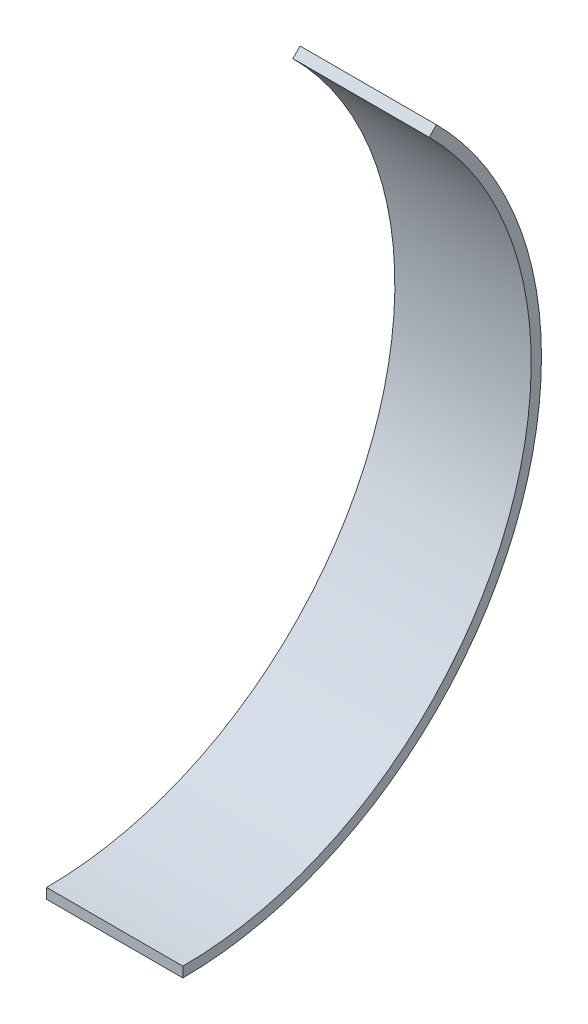
ISO-10303-21;
HEADER;
FILE_DESCRIPTION(('STEP AP214'),'2;1');
FILE_NAME('part.step','',(''),(''),'','','');
FILE_SCHEMA(('AUTOMOTIVE_DESIGN { 1 0 10303 214 1 1 1 1 }'));
ENDSEC;
DATA;
#1=APPLICATION_CONTEXT('core data for automotive mechanical design processes');
#2=APPLICATION_PROTOCOL_DEFINITION('international standard','automotive_design',2000,#1);
#3=PRODUCT_CONTEXT('',#1,'mechanical');
#4=PRODUCT('Part','Part','',(#3));
#5=PRODUCT_RELATED_PRODUCT_CATEGORY('part','',(#4));
#6=PRODUCT_DEFINITION_FORMATION('','',#4);
#7=PRODUCT_DEFINITION_CONTEXT('part definition',#1,'design');
#8=PRODUCT_DEFINITION('design','',#6,#7);
#9=PRODUCT_DEFINITION_SHAPE('','',#8);
#10=(LENGTH_UNIT() NAMED_UNIT(*) SI_UNIT(.MILLI.,.METRE.));
#11=(NAMED_UNIT(*) PLANE_ANGLE_UNIT() SI_UNIT($,.RADIAN.));
#12=(NAMED_UNIT(*) SI_UNIT($,.STERADIAN.) SOLID_ANGLE_UNIT());
#13=UNCERTAINTY_MEASURE_WITH_UNIT(LENGTH_MEASURE(1.E-05),#10,'distance_accuracy_value','');
#14=(GEOMETRIC_REPRESENTATION_CONTEXT(3) GLOBAL_UNCERTAINTY_ASSIGNED_CONTEXT((#13)) GLOBAL_UNIT_ASSIGNED_CONTEXT((#10,
#11,#12)) REPRESENTATION_CONTEXT('',''));
#15=CARTESIAN_POINT('',(0.,0.,0.));
#16=DIRECTION('',(0.,0.,1.));
#17=DIRECTION('',(1.,0.,0.));
#18=AXIS2_PLACEMENT_3D('',#15,#16,#17);
#19=CARTESIAN_POINT('',(0.,112.014,0.));
#20=DIRECTION('',(-1.,0.,0.));
#21=DIRECTION('',(0.,0.,1.));
#22=AXIS2_PLACEMENT_3D('',#19,#20,#21);
#23=CYLINDRICAL_SURFACE('',#22,115.316);
#24=CARTESIAN_POINT('',(0.,112.014,0.));
#25=DIRECTION('',(-1.,0.,0.));
#26=DIRECTION('',(0.,0.,1.));
#27=AXIS2_PLACEMENT_3D('',#24,#25,#26);
#28=CIRCLE('',#27,115.316);
#29=CARTESIAN_POINT('',(0.,193.554725579308,-81.5407255793075));
#30=VERTEX_POINT('',#29);
#31=CARTESIAN_POINT('',(0.,-3.302,0.));
#32=VERTEX_POINT('',#31);
#33=EDGE_CURVE('E11',#30,#32,#28,.T.);
#34=ORIENTED_EDGE('',*,*,#33,.F.);
#35=DIRECTION('',(1.,0.,0.));
#36=VECTOR('',#35,1.);
#37=CARTESIAN_POINT('',(0.,193.554725579308,-81.5407255793075));
#38=LINE('',#37,#36);
#39=CARTESIAN_POINT('',(43.841999946,193.554725579308,-81.5407255793075));
#40=VERTEX_POINT('',#39);
#41=EDGE_CURVE('E73',#30,#40,#38,.T.);
#42=ORIENTED_EDGE('',*,*,#41,.T.);
#43=CARTESIAN_POINT('',(43.841999946,112.014,0.));
#44=DIRECTION('',(-1.,0.,0.));
#45=DIRECTION('',(0.,0.,1.));
#46=AXIS2_PLACEMENT_3D('',#43,#44,#45);
#47=CIRCLE('',#46,115.316);
#48=CARTESIAN_POINT('',(43.841999946,-3.302,0.));
#49=VERTEX_POINT('',#48);
#50=EDGE_CURVE('E68',#40,#49,#47,.T.);
#51=ORIENTED_EDGE('',*,*,#50,.T.);
#52=DIRECTION('',(1.,0.,0.));
#53=VECTOR('',#52,1.);
#54=CARTESIAN_POINT('',(0.,-3.302,0.));
#55=LINE('',#54,#53);
#56=EDGE_CURVE('E71',#32,#49,#55,.T.);
#57=ORIENTED_EDGE('',*,*,#56,.F.);
#58=EDGE_LOOP('',(#34,#42,#51,#57));
#59=FACE_BOUND('',#58,.T.);
#60=ADVANCED_FACE('F32',(#59),#23,.T.);
#61=CARTESIAN_POINT('',(0.,193.554725579308,-81.5407255793075));
#62=DIRECTION('',(1.,0.,0.));
#63=DIRECTION('',(0.,0.,-1.));
#64=AXIS2_PLACEMENT_3D('',#61,#62,#63);
#65=PLANE('',#64);
#66=CARTESIAN_POINT('',(0.,112.014,0.));
#67=DIRECTION('',(-1.,0.,0.));
#68=DIRECTION('',(0.,0.,1.));
#69=AXIS2_PLACEMENT_3D('',#66,#67,#68);
#70=CIRCLE('',#69,112.014);
#71=CARTESIAN_POINT('',(0.,191.21985898783,-79.2058589878295));
#72=VERTEX_POINT('',#71);
#73=CARTESIAN_POINT('',(0.,0.,0.));
#74=VERTEX_POINT('',#73);
#75=EDGE_CURVE('E40',#72,#74,#70,.T.);
#76=ORIENTED_EDGE('',*,*,#75,.F.);
#77=DIRECTION('',(0.,-0.707106781186551,0.707106781186544));
#78=VECTOR('',#77,1.);
#79=CARTESIAN_POINT('',(0.,193.554725579308,-81.5407255793075));
#80=LINE('',#79,#78);
#81=EDGE_CURVE('E78',#30,#72,#80,.T.);
#82=ORIENTED_EDGE('',*,*,#81,.F.);
#83=ORIENTED_EDGE('',*,*,#33,.T.);
#84=DIRECTION('',(0.,1.,0.));
#85=VECTOR('',#84,1.);
#86=CARTESIAN_POINT('',(0.,-3.302,0.));
#87=LINE('',#86,#85);
#88=EDGE_CURVE('E90',#32,#74,#87,.T.);
#89=ORIENTED_EDGE('',*,*,#88,.T.);
#90=EDGE_LOOP('',(#76,#82,#83,#89));
#91=FACE_BOUND('',#90,.T.);
#92=ADVANCED_FACE('F34',(#91),#65,.F.);
#93=CARTESIAN_POINT('',(0.,112.014,0.));
#94=DIRECTION('',(-1.,0.,0.));
#95=DIRECTION('',(0.,0.,1.));
#96=AXIS2_PLACEMENT_3D('',#93,#94,#95);
#97=CYLINDRICAL_SURFACE('',#96,112.014);
#98=CARTESIAN_POINT('',(43.841999946,112.014,0.));
#99=DIRECTION('',(-1.,0.,0.));
#100=DIRECTION('',(0.,0.,1.));
#101=AXIS2_PLACEMENT_3D('',#98,#99,#100);
#102=CIRCLE('',#101,112.014);
#103=CARTESIAN_POINT('',(43.841999946,191.21985898783,-79.2058589878295));
#104=VERTEX_POINT('',#103);
#105=CARTESIAN_POINT('',(43.841999946,0.,0.));
#106=VERTEX_POINT('',#105);
#107=EDGE_CURVE('E77',#104,#106,#102,.T.);
#108=ORIENTED_EDGE('',*,*,#107,.F.);
#109=DIRECTION('',(1.,0.,0.));
#110=VECTOR('',#109,1.);
#111=CARTESIAN_POINT('',(0.,191.21985898783,-79.2058589878295));
#112=LINE('',#111,#110);
#113=EDGE_CURVE('E98',#72,#104,#112,.T.);
#114=ORIENTED_EDGE('',*,*,#113,.F.);
#115=ORIENTED_EDGE('',*,*,#75,.T.);
#116=DIRECTION('',(1.,0.,0.));
#117=VECTOR('',#116,1.);
#118=CARTESIAN_POINT('',(0.,0.,0.));
#119=LINE('',#118,#117);
#120=EDGE_CURVE('E86',#74,#106,#119,.T.);
#121=ORIENTED_EDGE('',*,*,#120,.T.);
#122=EDGE_LOOP('',(#108,#114,#115,#121));
#123=FACE_BOUND('',#122,.T.);
#124=ADVANCED_FACE('F104',(#123),#97,.F.);
#125=CARTESIAN_POINT('',(43.841999946,191.21985898783,-79.2058589878295));
#126=DIRECTION('',(-1.,0.,0.));
#127=DIRECTION('',(0.,0.,1.));
#128=AXIS2_PLACEMENT_3D('',#125,#126,#127);
#129=PLANE('',#128);
#130=DIRECTION('',(0.,0.707106781186551,-0.707106781186544));
#131=VECTOR('',#130,1.);
#132=CARTESIAN_POINT('',(43.841999946,191.21985898783,-79.2058589878295));
#133=LINE('',#132,#131);
#134=EDGE_CURVE('E96',#104,#40,#133,.T.);
#135=ORIENTED_EDGE('',*,*,#134,.F.);
#136=ORIENTED_EDGE('',*,*,#107,.T.);
#137=DIRECTION('',(0.,-1.,0.));
#138=VECTOR('',#137,1.);
#139=CARTESIAN_POINT('',(43.841999946,0.,0.));
#140=LINE('',#139,#138);
#141=EDGE_CURVE('E81',#106,#49,#140,.T.);
#142=ORIENTED_EDGE('',*,*,#141,.T.);
#143=ORIENTED_EDGE('',*,*,#50,.F.);
#144=EDGE_LOOP('',(#135,#136,#142,#143));
#145=FACE_BOUND('',#144,.T.);
#146=ADVANCED_FACE('F82',(#145),#129,.F.);
#147=CARTESIAN_POINT('',(0.,191.21985898783,-79.2058589878295));
#148=DIRECTION('',(0.,0.707106781186544,0.707106781186551));
#149=DIRECTION('',(-1.,0.,0.));
#150=AXIS2_PLACEMENT_3D('',#147,#148,#149);
#151=PLANE('',#150);
#152=ORIENTED_EDGE('',*,*,#41,.F.);
#153=ORIENTED_EDGE('',*,*,#81,.T.);
#154=ORIENTED_EDGE('',*,*,#113,.T.);
#155=ORIENTED_EDGE('',*,*,#134,.T.);
#156=EDGE_LOOP('',(#152,#153,#154,#155));
#157=FACE_BOUND('',#156,.T.);
#158=ADVANCED_FACE('F106',(#157),#151,.T.);
#159=CARTESIAN_POINT('',(0.,0.,0.));
#160=DIRECTION('',(0.,0.,-1.));
#161=DIRECTION('',(-1.,0.,0.));
#162=AXIS2_PLACEMENT_3D('',#159,#160,#161);
#163=PLANE('',#162);
#164=ORIENTED_EDGE('',*,*,#56,.T.);
#165=ORIENTED_EDGE('',*,*,#141,.F.);
#166=ORIENTED_EDGE('',*,*,#120,.F.);
#167=ORIENTED_EDGE('',*,*,#88,.F.);
#168=EDGE_LOOP('',(#164,#165,#166,#167));
#169=FACE_BOUND('',#168,.T.);
#170=ADVANCED_FACE('F89',(#169),#163,.F.);
#171=CLOSED_SHELL('',(#60,#92,#124,#146,#158,#170));
#172=MANIFOLD_SOLID_BREP('B2',#171);
#173=ADVANCED_BREP_SHAPE_REPRESENTATION('',(#18,#172),#14);
#174=SHAPE_DEFINITION_REPRESENTATION(#9,#173);
ENDSEC;
END-ISO-10303-21;
